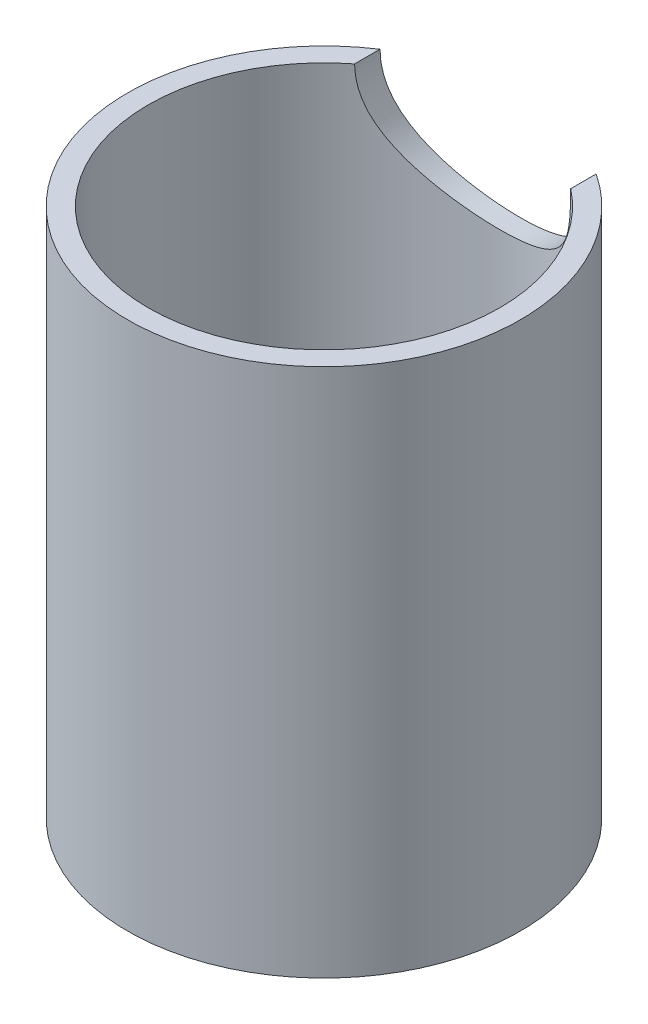
ISO-10303-21;
HEADER;
FILE_DESCRIPTION(('STEP AP214'),'2;1');
FILE_NAME('part.step','',(''),(''),'','','');
FILE_SCHEMA(('AUTOMOTIVE_DESIGN { 1 0 10303 214 1 1 1 1 }'));
ENDSEC;
DATA;
#1=APPLICATION_CONTEXT('core data for automotive mechanical design processes');
#2=APPLICATION_PROTOCOL_DEFINITION('international standard','automotive_design',2000,#1);
#3=PRODUCT_CONTEXT('',#1,'mechanical');
#4=PRODUCT('Part','Part','',(#3));
#5=PRODUCT_RELATED_PRODUCT_CATEGORY('part','',(#4));
#6=PRODUCT_DEFINITION_FORMATION('','',#4);
#7=PRODUCT_DEFINITION_CONTEXT('part definition',#1,'design');
#8=PRODUCT_DEFINITION('design','',#6,#7);
#9=PRODUCT_DEFINITION_SHAPE('','',#8);
#10=(LENGTH_UNIT() NAMED_UNIT(*) SI_UNIT(.MILLI.,.METRE.));
#11=(NAMED_UNIT(*) PLANE_ANGLE_UNIT() SI_UNIT($,.RADIAN.));
#12=(NAMED_UNIT(*) SI_UNIT($,.STERADIAN.) SOLID_ANGLE_UNIT());
#13=UNCERTAINTY_MEASURE_WITH_UNIT(LENGTH_MEASURE(1.E-05),#10,'distance_accuracy_value','');
#14=(GEOMETRIC_REPRESENTATION_CONTEXT(3) GLOBAL_UNCERTAINTY_ASSIGNED_CONTEXT((#13)) GLOBAL_UNIT_ASSIGNED_CONTEXT((#10,
#11,#12)) REPRESENTATION_CONTEXT('',''));
#15=CARTESIAN_POINT('',(0.,0.,0.));
#16=DIRECTION('',(0.,0.,1.));
#17=DIRECTION('',(1.,0.,0.));
#18=AXIS2_PLACEMENT_3D('',#15,#16,#17);
#19=CARTESIAN_POINT('',(0.,51.2,0.));
#20=DIRECTION('',(0.,1.,0.));
#21=DIRECTION('',(0.,0.,1.));
#22=AXIS2_PLACEMENT_3D('',#19,#20,#21);
#23=PLANE('',#22);
#24=DIRECTION('',(0.,0.,1.));
#25=VECTOR('',#24,1.);
#26=CARTESIAN_POINT('',(-10.45,51.2,-19.));
#27=LINE('',#26,#25);
#28=CARTESIAN_POINT('',(-10.45,51.2,-15.8681284340656));
#29=VERTEX_POINT('',#28);
#30=CARTESIAN_POINT('',(-10.45,51.2,-13.4088590118623));
#31=VERTEX_POINT('',#30);
#32=EDGE_CURVE('E62',#29,#31,#27,.T.);
#33=ORIENTED_EDGE('',*,*,#32,.F.);
#34=CARTESIAN_POINT('',(0.,51.2,0.));
#35=DIRECTION('',(0.,1.,0.));
#36=DIRECTION('',(0.,0.,1.));
#37=AXIS2_PLACEMENT_3D('',#34,#35,#36);
#38=CIRCLE('',#37,19.);
#39=CARTESIAN_POINT('',(10.45,51.2,-15.8681284340656));
#40=VERTEX_POINT('',#39);
#41=EDGE_CURVE('E85',#29,#40,#38,.T.);
#42=ORIENTED_EDGE('',*,*,#41,.T.);
#43=DIRECTION('',(0.,0.,1.));
#44=VECTOR('',#43,1.);
#45=CARTESIAN_POINT('',(10.45,51.2,-19.));
#46=LINE('',#45,#44);
#47=CARTESIAN_POINT('',(10.45,51.2,-13.4088590118623));
#48=VERTEX_POINT('',#47);
#49=EDGE_CURVE('E121',#48,#40,#46,.F.);
#50=ORIENTED_EDGE('',*,*,#49,.F.);
#51=CARTESIAN_POINT('',(0.,51.2,0.));
#52=DIRECTION('',(0.,1.,0.));
#53=DIRECTION('',(0.,0.,1.));
#54=AXIS2_PLACEMENT_3D('',#51,#52,#53);
#55=CIRCLE('',#54,17.);
#56=EDGE_CURVE('E94',#31,#48,#55,.T.);
#57=ORIENTED_EDGE('',*,*,#56,.F.);
#58=EDGE_LOOP('',(#33,#42,#50,#57));
#59=FACE_BOUND('',#58,.T.);
#60=ADVANCED_FACE('F33',(#59),#23,.T.);
#61=CARTESIAN_POINT('',(0.,0.,0.));
#62=DIRECTION('',(0.,1.,0.));
#63=DIRECTION('',(0.,0.,1.));
#64=AXIS2_PLACEMENT_3D('',#61,#62,#63);
#65=PLANE('',#64);
#66=CARTESIAN_POINT('',(0.,0.,0.));
#67=DIRECTION('',(0.,1.,0.));
#68=DIRECTION('',(0.,0.,1.));
#69=AXIS2_PLACEMENT_3D('',#66,#67,#68);
#70=CIRCLE('',#69,19.);
#71=CARTESIAN_POINT('',(-10.45,0.,-15.8681284340656));
#72=VERTEX_POINT('',#71);
#73=CARTESIAN_POINT('',(10.45,0.,-15.8681284340656));
#74=VERTEX_POINT('',#73);
#75=EDGE_CURVE('E90',#72,#74,#70,.T.);
#76=ORIENTED_EDGE('',*,*,#75,.F.);
#77=DIRECTION('',(0.,0.,1.));
#78=VECTOR('',#77,1.);
#79=CARTESIAN_POINT('',(-10.45,0.,-19.));
#80=LINE('',#79,#78);
#81=CARTESIAN_POINT('',(-10.45,0.,-13.4088590118623));
#82=VERTEX_POINT('',#81);
#83=EDGE_CURVE('E80',#72,#82,#80,.T.);
#84=ORIENTED_EDGE('',*,*,#83,.T.);
#85=CARTESIAN_POINT('',(0.,0.,0.));
#86=DIRECTION('',(0.,1.,0.));
#87=DIRECTION('',(0.,0.,1.));
#88=AXIS2_PLACEMENT_3D('',#85,#86,#87);
#89=CIRCLE('',#88,17.);
#90=CARTESIAN_POINT('',(10.45,0.,-13.4088590118623));
#91=VERTEX_POINT('',#90);
#92=EDGE_CURVE('E88',#82,#91,#89,.T.);
#93=ORIENTED_EDGE('',*,*,#92,.T.);
#94=DIRECTION('',(0.,0.,1.));
#95=VECTOR('',#94,1.);
#96=CARTESIAN_POINT('',(10.45,0.,-19.));
#97=LINE('',#96,#95);
#98=EDGE_CURVE('E55',#91,#74,#97,.F.);
#99=ORIENTED_EDGE('',*,*,#98,.T.);
#100=EDGE_LOOP('',(#76,#84,#93,#99));
#101=FACE_BOUND('',#100,.T.);
#102=ADVANCED_FACE('F87',(#101),#65,.F.);
#103=CARTESIAN_POINT('',(0.,51.2,0.));
#104=DIRECTION('',(0.,-1.,0.));
#105=DIRECTION('',(0.,0.,-1.));
#106=AXIS2_PLACEMENT_3D('',#103,#104,#105);
#107=CYLINDRICAL_SURFACE('',#106,19.);
#108=ORIENTED_EDGE('',*,*,#41,.F.);
#109=CARTESIAN_POINT('',(-10.45,51.2,-15.8681284340656));
#110=CARTESIAN_POINT('',(-10.4500012730181,51.0653833149891,-15.8681246559729));
#111=CARTESIAN_POINT('',(-10.4473981935161,50.9307864478376,-15.8698422115779));
#112=CARTESIAN_POINT('',(-10.4370032538798,50.6618869862102,-15.8766816326083));
#113=CARTESIAN_POINT('',(-10.4292116748264,50.5275843761886,-15.8818033136192));
#114=CARTESIAN_POINT('',(-10.3981046596639,50.1257493900968,-15.9022035166576));
#115=CARTESIAN_POINT('',(-10.3670568574151,49.8590162589393,-15.9225173529007));
#116=CARTESIAN_POINT('',(-10.2850919997626,49.3318171395036,-15.9755820898262));
#117=CARTESIAN_POINT('',(-10.2343115002847,49.0713208671769,-16.0082474732981));
#118=CARTESIAN_POINT('',(-10.1135634255716,48.5564693719258,-16.0848045161732));
#119=CARTESIAN_POINT('',(-10.0435929241274,48.3021150920111,-16.1286978876201));
#120=CARTESIAN_POINT('',(-9.88553018246522,47.8018502283056,-16.2260552771701));
#121=CARTESIAN_POINT('',(-9.79749089995467,47.5559173660677,-16.2794912687168));
#122=CARTESIAN_POINT('',(-9.60403995683278,47.0729436946843,-16.3943606685431));
#123=CARTESIAN_POINT('',(-9.49862864822692,46.8359027054843,-16.4557939147708));
#124=CARTESIAN_POINT('',(-9.27108162313204,46.3712752819912,-16.5850592272797));
#125=CARTESIAN_POINT('',(-9.14891684383235,46.1437061932698,-16.6529023479392));
#126=CARTESIAN_POINT('',(-8.8887926954681,45.6992566003047,-16.7931891214218));
#127=CARTESIAN_POINT('',(-8.75083177189294,45.482377151046,-16.8656332267182));
#128=CARTESIAN_POINT('',(-8.44524660649842,45.0388371524624,-17.0208707913538));
#129=CARTESIAN_POINT('',(-8.27603504615457,44.813377165401,-17.1039735239912));
#130=CARTESIAN_POINT('',(-7.92025692286623,44.3771517454434,-17.2716010378501));
#131=CARTESIAN_POINT('',(-7.73368933213889,44.1663871840702,-17.356125903044));
#132=CARTESIAN_POINT('',(-7.34394254747332,43.7603610419234,-17.5245996758007));
#133=CARTESIAN_POINT('',(-7.14075577283886,43.5651066169124,-17.6085483013791));
#134=CARTESIAN_POINT('',(-6.71875429802651,43.1912371415642,-17.7738481776533));
#135=CARTESIAN_POINT('',(-6.49994473541626,43.0126166652579,-17.8552002696029));
#136=CARTESIAN_POINT('',(-6.02796580951804,42.6583052928639,-18.0203050555937));
#137=CARTESIAN_POINT('',(-5.77346113451381,42.4842006174535,-18.1036579714908));
#138=CARTESIAN_POINT('',(-5.24829903158589,42.1582431644075,-18.262821138262));
#139=CARTESIAN_POINT('',(-4.97764042634378,42.0063920114297,-18.3386308383007));
#140=CARTESIAN_POINT('',(-4.42196345972371,41.7265930463403,-18.4804871163755));
#141=CARTESIAN_POINT('',(-4.13695324241697,41.5986318672827,-18.5465391496878));
#142=CARTESIAN_POINT('',(-3.55446192453808,41.3680942773136,-18.6669279387466));
#143=CARTESIAN_POINT('',(-3.25698249065588,41.2655144863877,-18.7212662542732));
#144=CARTESIAN_POINT('',(-2.67716156036428,41.0946097581584,-18.8125395654125));
#145=CARTESIAN_POINT('',(-2.39561869371007,41.0241454583119,-18.8505461022332));
#146=CARTESIAN_POINT('',(-1.82629028871861,40.9067196174583,-18.9141925377618));
#147=CARTESIAN_POINT('',(-1.53850506778543,40.8597568843797,-18.9398330637093));
#148=CARTESIAN_POINT('',(-0.959332065107864,40.7900428826343,-18.9779834579204));
#149=CARTESIAN_POINT('',(-0.667946639160714,40.7672765502572,-18.9905014956532));
#150=CARTESIAN_POINT('',(-0.0840349414601788,40.7462559718408,-19.0020572982258));
#151=CARTESIAN_POINT('',(0.208491238125646,40.7479997849005,-19.0010961304523));
#152=CARTESIAN_POINT('',(0.76138192815085,40.7744937192387,-18.986537018077));
#153=CARTESIAN_POINT('',(1.02190258118581,40.796812366127,-18.97427465686));
#154=CARTESIAN_POINT('',(1.53982717952239,40.8607784045931,-18.9392788647418));
#155=CARTESIAN_POINT('',(1.79723139030733,40.9024241376779,-18.9165463323066));
#156=CARTESIAN_POINT('',(2.30717744119805,41.0045568521245,-18.8611432232997));
#157=CARTESIAN_POINT('',(2.5597191899388,41.0650441871515,-18.8284724601834));
#158=CARTESIAN_POINT('',(3.05834942150661,41.2042006089911,-18.7539343956568));
#159=CARTESIAN_POINT('',(3.30443765326291,41.2828704020179,-18.7120667370384));
#160=CARTESIAN_POINT('',(3.79129051288055,41.4585271755928,-18.6195639348381));
#161=CARTESIAN_POINT('',(4.03197210941065,41.5556978168595,-18.5688413468723));
#162=CARTESIAN_POINT('',(4.5041424402967,41.7669661949012,-18.4599953673567));
#163=CARTESIAN_POINT('',(4.73562783881112,41.881070004232,-18.4018693218507));
#164=CARTESIAN_POINT('',(5.18824121521788,42.1252674186986,-18.279417775016));
#165=CARTESIAN_POINT('',(5.40937044515481,42.2553590839996,-18.215093025991));
#166=CARTESIAN_POINT('',(5.84049432233791,42.5307105559795,-18.0814707607809));
#167=CARTESIAN_POINT('',(6.05048492934415,42.6759758105097,-18.0121714613699));
#168=CARTESIAN_POINT('',(6.48046570029448,42.9972185556614,-17.8622736907849));
#169=CARTESIAN_POINT('',(6.69910080414364,43.1748188398789,-17.781261737982));
#170=CARTESIAN_POINT('',(7.12080538383842,43.546527105727,-17.6166222801085));
#171=CARTESIAN_POINT('',(7.32387371151187,43.7406363027964,-17.5329945827455));
#172=CARTESIAN_POINT('',(7.71384060763867,44.1446419237716,-17.3649587686544));
#173=CARTESIAN_POINT('',(7.90071979251648,44.3545567252083,-17.2805498467567));
#174=CARTESIAN_POINT('',(8.2572086769888,44.7890731994456,-17.1130738002932));
#175=CARTESIAN_POINT('',(8.42681820307708,45.0136750197678,-17.0300066892155));
#176=CARTESIAN_POINT('',(8.76216156562718,45.4972712232828,-16.8600984974949));
#177=CARTESIAN_POINT('',(8.92621372321557,45.7575485702563,-16.773577332291));
#178=CARTESIAN_POINT('',(9.23157338358675,46.293308113382,-16.6074766862903));
#179=CARTESIAN_POINT('',(9.37287755167582,46.5687925308484,-16.5278982240262));
#180=CARTESIAN_POINT('',(9.63098465736376,47.1327465828359,-16.3788369713242));
#181=CARTESIAN_POINT('',(9.74785006769434,47.4211807604486,-16.3093285822235));
#182=CARTESIAN_POINT('',(9.95602284359849,48.0097882905724,-16.1830919535635));
#183=CARTESIAN_POINT('',(10.0473407557039,48.3099567404351,-16.1263584421653));
#184=CARTESIAN_POINT('',(10.1785121378221,48.8236751008197,-16.0437477570263));
#185=CARTESIAN_POINT('',(10.2255185262193,49.0347704625161,-16.0137780908027));
#186=CARTESIAN_POINT('',(10.3064606327971,49.4603823158968,-15.9618037153635));
#187=CARTESIAN_POINT('',(10.3404001006948,49.6748978077028,-15.9397967212684));
#188=CARTESIAN_POINT('',(10.3949890356453,50.1071568553254,-15.9042551230562));
#189=CARTESIAN_POINT('',(10.4155869370567,50.3249096474307,-15.8907533975621));
#190=CARTESIAN_POINT('',(10.443108726044,50.7617680737177,-15.8726660496449));
#191=CARTESIAN_POINT('',(10.4500248155989,50.9808744080409,-15.8680855119231));
#192=CARTESIAN_POINT('',(10.45,51.2,-15.8681284340656));
#193=B_SPLINE_CURVE_WITH_KNOTS('',3,(#109,#110,#111,#112,#113,#114,#115,#116,#117,#118,#119,
#120,#121,#122,#123,#124,#125,#126,#127,#128,#129,#130,#131,#132,#133,#134,#135,#136,#137,#138,
#139,#140,#141,#142,#143,#144,#145,#146,#147,#148,#149,#150,#151,#152,#153,#154,#155,#156,#157,
#158,#159,#160,#161,#162,#163,#164,#165,#166,#167,#168,#169,#170,#171,#172,#173,#174,#175,#176,
#177,#178,#179,#180,#181,#182,#183,#184,#185,#186,#187,#188,#189,#190,#191,#192),.UNSPECIFIED.,
.F.,.F.,(4,2,2,2,2,2,2,2,2,2,2,2,2,2,2,2,2,2,2,2,2,2,2,2,2,2,2,2,2,2,2,2,2,2,2,2,2,2,2,2,2,4),
(0.,0.403774900877862,0.807527929500474,1.61421634347208,2.41541890435949,3.21674370550549,
4.01575261388323,4.81474533411242,5.61514205241606,6.41561760618315,7.29637563173928,
8.17718584693272,9.05840010095439,9.93932588987509,10.896356113444,11.853456171935,
12.8100190971677,13.7664545692164,14.6433457334633,15.5201924145922,16.3964928857487,
17.2727239651172,18.0570787544756,18.8413662493439,19.6256684665201,20.4100011514402,
21.202569498715,21.9954227660016,22.7881799298052,23.5812227060215,24.4595921876933,
25.338026393811,26.2174982342825,27.0969789098323,28.0545593291095,29.0122799953023,
29.9675216788514,30.92236843516,31.5768566276699,32.2311568663348,32.8879711427837,
33.5451596662769),.UNSPECIFIED.);
#194=EDGE_CURVE('E95',#29,#40,#193,.T.);
#195=ORIENTED_EDGE('',*,*,#194,.T.);
#196=EDGE_LOOP('',(#108,#195));
#197=FACE_BOUND('',#196,.T.);
#198=ORIENTED_EDGE('',*,*,#75,.T.);
#199=CARTESIAN_POINT('',(10.45,0.,-15.8681284340656));
#200=CARTESIAN_POINT('',(10.4500012730181,0.13461668501087,-15.8681246559729));
#201=CARTESIAN_POINT('',(10.4473981935161,0.269213552162404,-15.8698422115779));
#202=CARTESIAN_POINT('',(10.4370032538798,0.53811301378984,-15.8766816326083));
#203=CARTESIAN_POINT('',(10.4292116748264,0.672415623811373,-15.8818033136192));
#204=CARTESIAN_POINT('',(10.3981046596639,1.07425060990325,-15.9022035166576));
#205=CARTESIAN_POINT('',(10.3670568574151,1.3409837410607,-15.9225173529007));
#206=CARTESIAN_POINT('',(10.2850919997626,1.86818286049645,-15.9755820898262));
#207=CARTESIAN_POINT('',(10.2343115002847,2.12867913282309,-16.0082474732981));
#208=CARTESIAN_POINT('',(10.1135634255716,2.6435306280742,-16.0848045161732));
#209=CARTESIAN_POINT('',(10.0435929241274,2.89788490798893,-16.1286978876201));
#210=CARTESIAN_POINT('',(9.88553018246523,3.39814977169438,-16.2260552771701));
#211=CARTESIAN_POINT('',(9.79749089995467,3.64408263393226,-16.2794912687168));
#212=CARTESIAN_POINT('',(9.60403995683279,4.12705630531565,-16.3943606685431));
#213=CARTESIAN_POINT('',(9.49862864822693,4.36409729451573,-16.4557939147708));
#214=CARTESIAN_POINT('',(9.27108162313205,4.82872471800875,-16.5850592272797));
#215=CARTESIAN_POINT('',(9.14891684383235,5.0562938067302,-16.6529023479392));
#216=CARTESIAN_POINT('',(8.88879269546811,5.50074339969534,-16.7931891214218));
#217=CARTESIAN_POINT('',(8.75083177189294,5.71762284895399,-16.8656332267182));
#218=CARTESIAN_POINT('',(8.44524660649842,6.16116284753757,-17.0208707913538));
#219=CARTESIAN_POINT('',(8.27603504615457,6.38662283459905,-17.1039735239912));
#220=CARTESIAN_POINT('',(7.92025692286624,6.82284825455656,-17.2716010378501));
#221=CARTESIAN_POINT('',(7.7336893321389,7.03361281592981,-17.356125903044));
#222=CARTESIAN_POINT('',(7.34394254747332,7.43963895807659,-17.5245996758007));
#223=CARTESIAN_POINT('',(7.14075577283886,7.63489338308757,-17.6085483013791));
#224=CARTESIAN_POINT('',(6.71875429802652,8.00876285843584,-17.7738481776533));
#225=CARTESIAN_POINT('',(6.49994473541627,8.18738333474212,-17.8552002696029));
#226=CARTESIAN_POINT('',(6.02796580951805,8.54169470713606,-18.0203050555937));
#227=CARTESIAN_POINT('',(5.77346113451382,8.71579938254646,-18.1036579714908));
#228=CARTESIAN_POINT('',(5.2482990315859,9.04175683559255,-18.262821138262));
#229=CARTESIAN_POINT('',(4.97764042634379,9.19360798857028,-18.3386308383007));
#230=CARTESIAN_POINT('',(4.42196345972372,9.47340695365971,-18.4804871163755));
#231=CARTESIAN_POINT('',(4.13695324241697,9.60136813271735,-18.5465391496878));
#232=CARTESIAN_POINT('',(3.55446192453809,9.83190572268642,-18.6669279387466));
#233=CARTESIAN_POINT('',(3.25698249065589,9.93448551361228,-18.7212662542732));
#234=CARTESIAN_POINT('',(2.6771615603643,10.1053902418416,-18.8125395654125));
#235=CARTESIAN_POINT('',(2.39561869371008,10.1758545416881,-18.8505461022332));
#236=CARTESIAN_POINT('',(1.82629028871862,10.2932803825418,-18.9141925377618));
#237=CARTESIAN_POINT('',(1.53850506778544,10.3402431156203,-18.9398330637093));
#238=CARTESIAN_POINT('',(0.959332065107876,10.4099571173657,-18.9779834579204));
#239=CARTESIAN_POINT('',(0.667946639160726,10.4327234497428,-18.9905014956532));
#240=CARTESIAN_POINT('',(0.0840349414601904,10.4537440281592,-19.0020572982258));
#241=CARTESIAN_POINT('',(-0.208491238125635,10.4520002150995,-19.0010961304523));
#242=CARTESIAN_POINT('',(-0.76138192815084,10.4255062807613,-18.986537018077));
#243=CARTESIAN_POINT('',(-1.0219025811858,10.403187633873,-18.97427465686));
#244=CARTESIAN_POINT('',(-1.53982717952238,10.3392215954069,-18.9392788647418));
#245=CARTESIAN_POINT('',(-1.79723139030732,10.2975758623221,-18.9165463323066));
#246=CARTESIAN_POINT('',(-2.30717744119804,10.1954431478755,-18.8611432232997));
#247=CARTESIAN_POINT('',(-2.55971918993879,10.1349558128485,-18.8284724601834));
#248=CARTESIAN_POINT('',(-3.0583494215066,9.9957993910089,-18.7539343956568));
#249=CARTESIAN_POINT('',(-3.3044376532629,9.91712959798211,-18.7120667370384));
#250=CARTESIAN_POINT('',(-3.79129051288054,9.74147282440722,-18.6195639348381));
#251=CARTESIAN_POINT('',(-4.03197210941064,9.64430218314055,-18.5688413468723));
#252=CARTESIAN_POINT('',(-4.50414244029669,9.4330338050988,-18.4599953673567));
#253=CARTESIAN_POINT('',(-4.73562783881111,9.31892999576798,-18.4018693218507));
#254=CARTESIAN_POINT('',(-5.18824121521788,9.07473258130145,-18.279417775016));
#255=CARTESIAN_POINT('',(-5.4093704451548,8.94464091600042,-18.215093025991));
#256=CARTESIAN_POINT('',(-5.8404943223379,8.66928944402046,-18.0814707607809));
#257=CARTESIAN_POINT('',(-6.05048492934414,8.52402418949034,-18.0121714613699));
#258=CARTESIAN_POINT('',(-6.48046570029447,8.2027814443386,-17.8622736907849));
#259=CARTESIAN_POINT('',(-6.69910080414364,8.02518116012107,-17.781261737982));
#260=CARTESIAN_POINT('',(-7.12080538383842,7.65347289427305,-17.6166222801085));
#261=CARTESIAN_POINT('',(-7.32387371151186,7.45936369720357,-17.5329945827455));
#262=CARTESIAN_POINT('',(-7.71384060763866,7.0553580762284,-17.3649587686544));
#263=CARTESIAN_POINT('',(-7.90071979251648,6.8454432747917,-17.2805498467567));
#264=CARTESIAN_POINT('',(-8.2572086769888,6.41092680055438,-17.1130738002932));
#265=CARTESIAN_POINT('',(-8.42681820307707,6.18632498023225,-17.0300066892155));
#266=CARTESIAN_POINT('',(-8.76216156562717,5.70272877671721,-16.8600984974949));
#267=CARTESIAN_POINT('',(-8.92621372321556,5.44245142974373,-16.773577332291));
#268=CARTESIAN_POINT('',(-9.23157338358674,4.906691886618,-16.6074766862903));
#269=CARTESIAN_POINT('',(-9.37287755167582,4.63120746915158,-16.5278982240262));
#270=CARTESIAN_POINT('',(-9.63098465736375,4.06725341716415,-16.3788369713242));
#271=CARTESIAN_POINT('',(-9.74785006769433,3.77881923955143,-16.3093285822235));
#272=CARTESIAN_POINT('',(-9.95602284359848,3.19021170942761,-16.1830919535635));
#273=CARTESIAN_POINT('',(-10.0473407557039,2.89004325956497,-16.1263584421653));
#274=CARTESIAN_POINT('',(-10.1785121378221,2.37632489918034,-16.0437477570263));
#275=CARTESIAN_POINT('',(-10.2255185262193,2.16522953748394,-16.0137780908027));
#276=CARTESIAN_POINT('',(-10.3064606327971,1.73961768410317,-15.9618037153635));
#277=CARTESIAN_POINT('',(-10.3404001006948,1.52510219229721,-15.9397967212684));
#278=CARTESIAN_POINT('',(-10.3949890356453,1.09284314467457,-15.9042551230562));
#279=CARTESIAN_POINT('',(-10.4155869370567,0.875090352569286,-15.8907533975621));
#280=CARTESIAN_POINT('',(-10.443108726044,0.438231926282308,-15.8726660496449));
#281=CARTESIAN_POINT('',(-10.4500248155989,0.219125591959081,-15.8680855119231));
#282=CARTESIAN_POINT('',(-10.45,0.,-15.8681284340656));
#283=B_SPLINE_CURVE_WITH_KNOTS('',3,(#199,#200,#201,#202,#203,#204,#205,#206,#207,#208,#209,
#210,#211,#212,#213,#214,#215,#216,#217,#218,#219,#220,#221,#222,#223,#224,#225,#226,#227,#228,
#229,#230,#231,#232,#233,#234,#235,#236,#237,#238,#239,#240,#241,#242,#243,#244,#245,#246,#247,
#248,#249,#250,#251,#252,#253,#254,#255,#256,#257,#258,#259,#260,#261,#262,#263,#264,#265,#266,
#267,#268,#269,#270,#271,#272,#273,#274,#275,#276,#277,#278,#279,#280,#281,#282),.UNSPECIFIED.,
.F.,.F.,(4,2,2,2,2,2,2,2,2,2,2,2,2,2,2,2,2,2,2,2,2,2,2,2,2,2,2,2,2,2,2,2,2,2,2,2,2,2,2,2,2,4),
(0.,0.403774900877858,0.807527929500476,1.61421634347208,2.41541890435949,3.21674370550549,
4.01575261388323,4.81474533411241,5.61514205241605,6.41561760618316,7.29637563173928,
8.17718584693272,9.05840010095439,9.93932588987509,10.896356113444,11.853456171935,
12.8100190971677,13.7664545692164,14.6433457334633,15.5201924145922,16.3964928857487,
17.2727239651172,18.0570787544756,18.8413662493439,19.6256684665201,20.4100011514402,
21.202569498715,21.9954227660016,22.7881799298052,23.5812227060215,24.4595921876933,
25.338026393811,26.2174982342825,27.0969789098323,28.0545593291094,29.0122799953022,
29.9675216788514,30.92236843516,31.5768566276699,32.2311568663348,32.8879711427837,
33.5451596662769),.UNSPECIFIED.);
#284=EDGE_CURVE('E91',#74,#72,#283,.T.);
#285=ORIENTED_EDGE('',*,*,#284,.T.);
#286=EDGE_LOOP('',(#198,#285));
#287=FACE_BOUND('',#286,.T.);
#288=ADVANCED_FACE('F35',(#197,#287),#107,.T.);
#289=CARTESIAN_POINT('',(0.,51.2,0.));
#290=DIRECTION('',(0.,-1.,0.));
#291=DIRECTION('',(0.,0.,-1.));
#292=AXIS2_PLACEMENT_3D('',#289,#290,#291);
#293=CYLINDRICAL_SURFACE('',#292,17.);
#294=CARTESIAN_POINT('',(-10.45,51.2,-13.4088590118623));
#295=CARTESIAN_POINT('',(-10.4500016789845,51.0686337794725,-13.4088541572394));
#296=CARTESIAN_POINT('',(-10.4475222672895,50.9372882052657,-13.4107904105973));
#297=CARTESIAN_POINT('',(-10.4376246403045,50.6749055694247,-13.4184965470656));
#298=CARTESIAN_POINT('',(-10.4302067967983,50.5438684853114,-13.4242661415876));
#299=CARTESIAN_POINT('',(-10.400605590222,50.1519283260879,-13.4472327477521));
#300=CARTESIAN_POINT('',(-10.3710744194583,49.8918562018527,-13.4700878319086));
#301=CARTESIAN_POINT('',(-10.2932705861211,49.3784713776937,-13.5296315402958));
#302=CARTESIAN_POINT('',(-10.2451571605142,49.1251202835521,-13.5662025535828));
#303=CARTESIAN_POINT('',(-10.1309307273382,48.6246063490174,-13.6517151181135));
#304=CARTESIAN_POINT('',(-10.0648137995665,48.3774448692065,-13.7006593634209));
#305=CARTESIAN_POINT('',(-9.9157551274329,47.8917422628029,-13.8089183449436));
#306=CARTESIAN_POINT('',(-9.83288230639036,47.6531703929348,-13.8681904649574));
#307=CARTESIAN_POINT('',(-9.65106590346022,47.1847027797343,-13.9953298109086));
#308=CARTESIAN_POINT('',(-9.55212286921314,46.9548067410757,-14.0631967439348));
#309=CARTESIAN_POINT('',(-9.23185957800874,46.278166891187,-14.2772046451817));
#310=CARTESIAN_POINT('',(-8.98735726104967,45.8452815737382,-14.4335609359013));
#311=CARTESIAN_POINT('',(-8.56152102231486,45.2016215815086,-14.6878355359943));
#312=CARTESIAN_POINT('',(-8.39905671873858,44.9762261865592,-14.7815453362588));
#313=CARTESIAN_POINT('',(-8.05705211526095,44.5394235374984,-14.9707063775197));
#314=CARTESIAN_POINT('',(-7.87751062933236,44.3280172566763,-15.0661577390966));
#315=CARTESIAN_POINT('',(-7.50200073041893,43.9199288153027,-15.2566163813905));
#316=CARTESIAN_POINT('',(-7.30602411072883,43.7232541047137,-15.3516234149376));
#317=CARTESIAN_POINT('',(-6.89843574862987,43.3456232971896,-15.5390437858373));
#318=CARTESIAN_POINT('',(-6.686828909363,43.1646623093462,-15.6314579241249));
#319=CARTESIAN_POINT('',(-6.22318813172864,42.7993252754255,-15.8221938533834));
#320=CARTESIAN_POINT('',(-5.96931166941218,42.6169864808142,-15.9199580569215));
#321=CARTESIAN_POINT('',(-5.44401157593134,42.2745569197055,-16.1071562760401));
#322=CARTESIAN_POINT('',(-5.17258624093412,42.1144683182624,-16.1965894806942));
#323=CARTESIAN_POINT('',(-4.61387811632682,41.818395588823,-16.3645087120849));
#324=CARTESIAN_POINT('',(-4.32660603717113,41.682395435543,-16.4430020093315));
#325=CARTESIAN_POINT('',(-3.73801548887643,41.4362176937304,-16.5867100642199));
#326=CARTESIAN_POINT('',(-3.43669948300291,41.3260355970649,-16.6519271397829));
#327=CARTESIAN_POINT('',(-2.85296304022826,41.1428038855092,-16.7612603522348));
#328=CARTESIAN_POINT('',(-2.57162886042506,41.067156653719,-16.8068270356898));
#329=CARTESIAN_POINT('',(-2.00179907478318,40.9393699558824,-16.8841770592588));
#330=CARTESIAN_POINT('',(-1.71330390039303,40.8872290771925,-16.9159612276458));
#331=CARTESIAN_POINT('',(-1.13196010348984,40.8073495843409,-16.9647777371909));
#332=CARTESIAN_POINT('',(-0.839115321493686,40.7795906093133,-16.9818223868577));
#333=CARTESIAN_POINT('',(-0.251650308829427,40.7488921879124,-17.0006764963493));
#334=CARTESIAN_POINT('',(0.042969724049491,40.7459500259374,-17.0024876231158));
#335=CARTESIAN_POINT('',(0.592782921886378,40.7636868022256,-16.9915893232121));
#336=CARTESIAN_POINT('',(0.848117536596149,40.7813416709023,-16.9807388347227));
#337=CARTESIAN_POINT('',(1.35605911944278,40.835212867093,-16.9477389571389));
#338=CARTESIAN_POINT('',(1.60866638039186,40.8714271813951,-16.9255907935466));
#339=CARTESIAN_POINT('',(2.10941622031666,40.9619527320886,-16.870501610569));
#340=CARTESIAN_POINT('',(2.35755863344681,41.0162646392537,-16.8375601911404));
#341=CARTESIAN_POINT('',(2.84779298464471,41.1423343585281,-16.7616111458558));
#342=CARTESIAN_POINT('',(3.08988466956759,41.214092899211,-16.7186030996189));
#343=CARTESIAN_POINT('',(3.56750323884863,41.3745672383424,-16.6232502846652));
#344=CARTESIAN_POINT('',(3.80300258576442,41.4633446654061,-16.5708716307036));
#345=CARTESIAN_POINT('',(4.26540382756851,41.6568519652036,-16.4579160849065));
#346=CARTESIAN_POINT('',(4.49230263473468,41.7615875006499,-16.3973362837594));
#347=CARTESIAN_POINT('',(4.9363898310726,41.9860732790475,-16.2691566174627));
#348=CARTESIAN_POINT('',(5.15358069168549,42.1058196706719,-16.201558553746));
#349=CARTESIAN_POINT('',(5.57760030877383,42.3595279951062,-16.0605206469045));
#350=CARTESIAN_POINT('',(5.78442531644258,42.4934950169632,-15.9870787148415));
#351=CARTESIAN_POINT('',(6.21159968858566,42.7919999155316,-15.8263786899815));
#352=CARTESIAN_POINT('',(6.4305150799037,42.9582731499004,-15.7385287542204));
#353=CARTESIAN_POINT('',(6.85365645458798,43.3066474686888,-15.5589277981068));
#354=CARTESIAN_POINT('',(7.05788135598757,43.4887497167513,-15.4671764912054));
#355=CARTESIAN_POINT('',(7.45130945292395,43.8681993204549,-15.2815370133693));
#356=CARTESIAN_POINT('',(7.6404874454889,44.0655712051773,-15.1876455826355));
#357=CARTESIAN_POINT('',(8.0028202731944,44.4745253456817,-14.9998836905459));
#358=CARTESIAN_POINT('',(8.17597445606018,44.6861081793385,-14.9060132301989));
#359=CARTESIAN_POINT('',(8.52629228374867,45.1502353099754,-14.7087608914549));
#360=CARTESIAN_POINT('',(8.70123066437343,45.4045874092517,-14.605664251382));
#361=CARTESIAN_POINT('',(9.0288700039467,45.9295402667141,-14.4054289768934));
#362=CARTESIAN_POINT('',(9.18156733704143,46.2001436641402,-14.3082913154328));
#363=CARTESIAN_POINT('',(9.46288043415531,46.7555687262275,-14.1238132069251));
#364=CARTESIAN_POINT('',(9.5915758442556,47.0403392452474,-14.0364407570738));
#365=CARTESIAN_POINT('',(9.82392353738529,47.6234870355837,-13.8748183284782));
#366=CARTESIAN_POINT('',(9.92758421873631,47.9218597037887,-13.8005639513059));
#367=CARTESIAN_POINT('',(10.0881609343868,48.4627535593275,-13.6834415964154));
#368=CARTESIAN_POINT('',(10.150345126634,48.7030028219605,-13.6372647011029));
#369=CARTESIAN_POINT('',(10.2577238457191,49.1891461560396,-13.5566816989895));
#370=CARTESIAN_POINT('',(10.3029244168148,49.4350381861752,-13.5222714049955));
#371=CARTESIAN_POINT('',(10.3759666287514,49.932888530347,-13.4663088771022));
#372=CARTESIAN_POINT('',(10.4036692599731,50.1848793069361,-13.4448596672739));
#373=CARTESIAN_POINT('',(10.4314356690218,50.5645446718829,-13.4233106521757));
#374=CARTESIAN_POINT('',(10.4383932457931,50.6914639387983,-13.4178983904864));
#375=CARTESIAN_POINT('',(10.4476763220687,50.9455825850287,-13.4106703006094));
#376=CARTESIAN_POINT('',(10.4500014997864,51.0727819831885,-13.408854722263));
#377=CARTESIAN_POINT('',(10.45,51.2,-13.4088590118623));
#378=B_SPLINE_CURVE_WITH_KNOTS('',3,(#294,#295,#296,#297,#298,#299,#300,#301,#302,#303,#304,
#305,#306,#307,#308,#309,#310,#311,#312,#313,#314,#315,#316,#317,#318,#319,#320,#321,#322,#323,
#324,#325,#326,#327,#328,#329,#330,#331,#332,#333,#334,#335,#336,#337,#338,#339,#340,#341,#342,
#343,#344,#345,#346,#347,#348,#349,#350,#351,#352,#353,#354,#355,#356,#357,#358,#359,#360,#361,
#362,#363,#364,#365,#366,#367,#368,#369,#370,#371,#372,#373,#374,#375,#376,#377),.UNSPECIFIED.,
.F.,.F.,(4,2,2,2,2,2,2,2,2,2,2,2,2,2,2,2,2,2,2,2,2,2,2,2,2,2,2,2,2,2,2,2,2,2,2,2,2,2,2,2,2,4),
(0.,0.39402052027217,0.788011380548571,1.57497685216363,2.35534307528147,3.13587935661563,
3.91326803027608,4.69063021765164,6.24793899173511,7.12696615499735,8.00605441220541,
8.88558427651732,9.76483939782744,10.7460513373218,11.7273586868752,12.7080107313461,
13.6884914147566,14.5718150911893,15.4550856761081,16.3376179552878,17.2200536613366,
17.9876550034102,18.7551730985337,19.5227196443004,20.290298248409,21.0607107784408,
21.8313973277269,22.6018865455762,23.3726524290886,24.2375676876565,25.1025465828596,
25.9689450406774,26.835378751129,27.8105769014045,28.785933856149,29.7579943221836,
30.7297282397746,31.4861697211284,32.2423417388797,33.0044478925343,33.3860046963116,
33.7675880037605),.UNSPECIFIED.);
#379=EDGE_CURVE('E11',#31,#48,#378,.T.);
#380=ORIENTED_EDGE('',*,*,#379,.F.);
#381=ORIENTED_EDGE('',*,*,#56,.T.);
#382=EDGE_LOOP('',(#380,#381));
#383=FACE_BOUND('',#382,.T.);
#384=CARTESIAN_POINT('',(10.45,0.,-13.4088590118623));
#385=CARTESIAN_POINT('',(10.4500016789845,0.131366220527547,-13.4088541572394));
#386=CARTESIAN_POINT('',(10.4475222672895,0.262711794734319,-13.4107904105973));
#387=CARTESIAN_POINT('',(10.4376246403045,0.525094430575268,-13.4184965470656));
#388=CARTESIAN_POINT('',(10.4302067967983,0.656131514688558,-13.4242661415876));
#389=CARTESIAN_POINT('',(10.400605590222,1.0480716739121,-13.4472327477521));
#390=CARTESIAN_POINT('',(10.3710744194583,1.30814379814734,-13.4700878319086));
#391=CARTESIAN_POINT('',(10.2932705861211,1.82152862230625,-13.5296315402958));
#392=CARTESIAN_POINT('',(10.2451571605142,2.07487971644789,-13.5662025535829));
#393=CARTESIAN_POINT('',(10.1309307273382,2.5753936509826,-13.6517151181135));
#394=CARTESIAN_POINT('',(10.0648137995665,2.82255513079347,-13.7006593634209));
#395=CARTESIAN_POINT('',(9.9157551274329,3.30825773719713,-13.8089183449436));
#396=CARTESIAN_POINT('',(9.83288230639037,3.54682960706515,-13.8681904649574));
#397=CARTESIAN_POINT('',(9.65106590346022,4.01529722026574,-13.9953298109086));
#398=CARTESIAN_POINT('',(9.55212286921314,4.24519325892428,-14.0631967439348));
#399=CARTESIAN_POINT('',(9.23185957800874,4.92183310881298,-14.2772046451817));
#400=CARTESIAN_POINT('',(8.98735726104967,5.35471842626176,-14.4335609359013));
#401=CARTESIAN_POINT('',(8.56152102231486,5.99837841849143,-14.6878355359943));
#402=CARTESIAN_POINT('',(8.39905671873859,6.22377381344076,-14.7815453362588));
#403=CARTESIAN_POINT('',(8.05705211526095,6.66057646250158,-14.9707063775197));
#404=CARTESIAN_POINT('',(7.87751062933237,6.87198274332373,-15.0661577390966));
#405=CARTESIAN_POINT('',(7.50200073041894,7.28007118469729,-15.2566163813905));
#406=CARTESIAN_POINT('',(7.30602411072884,7.47674589528631,-15.3516234149375));
#407=CARTESIAN_POINT('',(6.89843574862988,7.85437670281038,-15.5390437858373));
#408=CARTESIAN_POINT('',(6.68682890936302,8.03533769065375,-15.6314579241248));
#409=CARTESIAN_POINT('',(6.22318813172866,8.40067472457449,-15.8221938533834));
#410=CARTESIAN_POINT('',(5.9693116694122,8.58301351918576,-15.9199580569214));
#411=CARTESIAN_POINT('',(5.44401157593135,8.92544308029453,-16.1071562760401));
#412=CARTESIAN_POINT('',(5.17258624093414,9.08553168173755,-16.1965894806942));
#413=CARTESIAN_POINT('',(4.61387811632684,9.38160441117704,-16.3645087120849));
#414=CARTESIAN_POINT('',(4.32660603717115,9.51760456445695,-16.4430020093315));
#415=CARTESIAN_POINT('',(3.73801548887644,9.76378230626955,-16.5867100642199));
#416=CARTESIAN_POINT('',(3.43669948300293,9.87396440293508,-16.6519271397829));
#417=CARTESIAN_POINT('',(2.85296304022828,10.0571961144908,-16.7612603522348));
#418=CARTESIAN_POINT('',(2.57162886042507,10.132843346281,-16.8068270356898));
#419=CARTESIAN_POINT('',(2.00179907478319,10.2606300441176,-16.8841770592588));
#420=CARTESIAN_POINT('',(1.71330390039305,10.3127709228075,-16.9159612276458));
#421=CARTESIAN_POINT('',(1.13196010348985,10.3926504156591,-16.9647777371909));
#422=CARTESIAN_POINT('',(0.8391153214937,10.4204093906867,-16.9818223868577));
#423=CARTESIAN_POINT('',(0.251650308829441,10.4511078120876,-17.0006764963493));
#424=CARTESIAN_POINT('',(-0.0429697240494779,10.4540499740626,-17.0024876231158));
#425=CARTESIAN_POINT('',(-0.592782921886365,10.4363131977744,-16.9915893232121));
#426=CARTESIAN_POINT('',(-0.848117536596136,10.4186583290978,-16.9807388347227));
#427=CARTESIAN_POINT('',(-1.35605911944277,10.364787132907,-16.9477389571389));
#428=CARTESIAN_POINT('',(-1.60866638039185,10.328572818605,-16.9255907935466));
#429=CARTESIAN_POINT('',(-2.10941622031665,10.2380472679114,-16.870501610569));
#430=CARTESIAN_POINT('',(-2.3575586334468,10.1837353607463,-16.8375601911404));
#431=CARTESIAN_POINT('',(-2.84779298464469,10.0576656414719,-16.7616111458558));
#432=CARTESIAN_POINT('',(-3.08988466956758,9.98590710078902,-16.7186030996189));
#433=CARTESIAN_POINT('',(-3.56750323884862,9.82543276165759,-16.6232502846652));
#434=CARTESIAN_POINT('',(-3.8030025857644,9.73665533459388,-16.5708716307036));
#435=CARTESIAN_POINT('',(-4.26540382756849,9.54314803479644,-16.4579160849065));
#436=CARTESIAN_POINT('',(-4.49230263473467,9.43841249935007,-16.3973362837594));
#437=CARTESIAN_POINT('',(-4.93638983107259,9.21392672095255,-16.2691566174627));
#438=CARTESIAN_POINT('',(-5.15358069168548,9.09418032932807,-16.201558553746));
#439=CARTESIAN_POINT('',(-5.57760030877382,8.84047200489378,-16.0605206469045));
#440=CARTESIAN_POINT('',(-5.78442531644257,8.70650498303678,-15.9870787148415));
#441=CARTESIAN_POINT('',(-6.21159968858565,8.40800008446845,-15.8263786899815));
#442=CARTESIAN_POINT('',(-6.43051507990369,8.24172685009958,-15.7385287542204));
#443=CARTESIAN_POINT('',(-6.85365645458797,7.89335253131125,-15.5589277981068));
#444=CARTESIAN_POINT('',(-7.05788135598756,7.71125028324875,-15.4671764912054));
#445=CARTESIAN_POINT('',(-7.45130945292394,7.33180067954512,-15.2815370133693));
#446=CARTESIAN_POINT('',(-7.6404874454889,7.13442879482267,-15.1876455826355));
#447=CARTESIAN_POINT('',(-8.0028202731944,6.7254746543183,-14.9998836905459));
#448=CARTESIAN_POINT('',(-8.17597445606017,6.5138918206615,-14.9060132301989));
#449=CARTESIAN_POINT('',(-8.52629228374866,6.04976469002462,-14.7087608914549));
#450=CARTESIAN_POINT('',(-8.70123066437343,5.7954125907483,-14.605664251382));
#451=CARTESIAN_POINT('',(-9.02887000394669,5.27045973328591,-14.4054289768934));
#452=CARTESIAN_POINT('',(-9.18156733704143,4.99985633585977,-14.3082913154328));
#453=CARTESIAN_POINT('',(-9.4628804341553,4.44443127377249,-14.1238132069251));
#454=CARTESIAN_POINT('',(-9.59157584425559,4.15966075475266,-14.0364407570738));
#455=CARTESIAN_POINT('',(-9.82392353738528,3.57651296441628,-13.8748183284782));
#456=CARTESIAN_POINT('',(-9.92758421873631,3.27814029621129,-13.8005639513059));
#457=CARTESIAN_POINT('',(-10.0881609343868,2.73724644067248,-13.6834415964154));
#458=CARTESIAN_POINT('',(-10.150345126634,2.4969971780395,-13.6372647011029));
#459=CARTESIAN_POINT('',(-10.2577238457191,2.01085384396039,-13.5566816989895));
#460=CARTESIAN_POINT('',(-10.3029244168148,1.76496181382482,-13.5222714049955));
#461=CARTESIAN_POINT('',(-10.3759666287514,1.26711146965298,-13.4663088771022));
#462=CARTESIAN_POINT('',(-10.4036692599731,1.01512069306391,-13.4448596672739));
#463=CARTESIAN_POINT('',(-10.4314356690218,0.635455328117067,-13.4233106521757));
#464=CARTESIAN_POINT('',(-10.4383932457931,0.508536061201726,-13.4178983904864));
#465=CARTESIAN_POINT('',(-10.4476763220687,0.254417414971308,-13.4106703006094));
#466=CARTESIAN_POINT('',(-10.4500014997864,0.127218016811463,-13.408854722263));
#467=CARTESIAN_POINT('',(-10.45,0.,-13.4088590118623));
#468=B_SPLINE_CURVE_WITH_KNOTS('',3,(#384,#385,#386,#387,#388,#389,#390,#391,#392,#393,#394,
#395,#396,#397,#398,#399,#400,#401,#402,#403,#404,#405,#406,#407,#408,#409,#410,#411,#412,#413,
#414,#415,#416,#417,#418,#419,#420,#421,#422,#423,#424,#425,#426,#427,#428,#429,#430,#431,#432,
#433,#434,#435,#436,#437,#438,#439,#440,#441,#442,#443,#444,#445,#446,#447,#448,#449,#450,#451,
#452,#453,#454,#455,#456,#457,#458,#459,#460,#461,#462,#463,#464,#465,#466,#467),.UNSPECIFIED.,
.F.,.F.,(4,2,2,2,2,2,2,2,2,2,2,2,2,2,2,2,2,2,2,2,2,2,2,2,2,2,2,2,2,2,2,2,2,2,2,2,2,2,2,2,2,4),
(0.,0.394020520272171,0.788011380548565,1.57497685216363,2.35534307528147,3.13587935661562,
3.91326803027607,4.69063021765164,6.24793899173511,7.12696615499734,8.0060544122054,
8.88558427651731,9.76483939782743,10.7460513373218,11.7273586868751,12.7080107313461,
13.6884914147566,14.5718150911893,15.4550856761081,16.3376179552878,17.2200536613366,
17.9876550034102,18.7551730985337,19.5227196443004,20.2902982484089,21.0607107784408,
21.8313973277269,22.6018865455762,23.3726524290886,24.2375676876565,25.1025465828596,
25.9689450406774,26.835378751129,27.8105769014045,28.785933856149,29.7579943221836,
30.7297282397746,31.4861697211284,32.2423417388797,33.0044478925343,33.3860046963116,
33.7675880037605),.UNSPECIFIED.);
#469=EDGE_CURVE('E48',#91,#82,#468,.T.);
#470=ORIENTED_EDGE('',*,*,#469,.F.);
#471=ORIENTED_EDGE('',*,*,#92,.F.);
#472=EDGE_LOOP('',(#470,#471));
#473=FACE_BOUND('',#472,.T.);
#474=ADVANCED_FACE('F93',(#383,#473),#293,.F.);
#475=CARTESIAN_POINT('',(0.,0.,-19.));
#476=DIRECTION('',(0.,0.,1.));
#477=DIRECTION('',(1.,0.,0.));
#478=AXIS2_PLACEMENT_3D('',#475,#476,#477);
#479=CYLINDRICAL_SURFACE('',#478,10.45);
#480=ORIENTED_EDGE('',*,*,#98,.F.);
#481=ORIENTED_EDGE('',*,*,#469,.T.);
#482=ORIENTED_EDGE('',*,*,#83,.F.);
#483=ORIENTED_EDGE('',*,*,#284,.F.);
#484=EDGE_LOOP('',(#480,#481,#482,#483));
#485=FACE_BOUND('',#484,.T.);
#486=ADVANCED_FACE('F79',(#485),#479,.F.);
#487=CARTESIAN_POINT('',(0.,51.2,-19.));
#488=DIRECTION('',(0.,0.,1.));
#489=DIRECTION('',(1.,0.,0.));
#490=AXIS2_PLACEMENT_3D('',#487,#488,#489);
#491=CYLINDRICAL_SURFACE('',#490,10.45);
#492=ORIENTED_EDGE('',*,*,#32,.T.);
#493=ORIENTED_EDGE('',*,*,#379,.T.);
#494=ORIENTED_EDGE('',*,*,#49,.T.);
#495=ORIENTED_EDGE('',*,*,#194,.F.);
#496=EDGE_LOOP('',(#492,#493,#494,#495));
#497=FACE_BOUND('',#496,.T.);
#498=ADVANCED_FACE('F112',(#497),#491,.F.);
#499=CLOSED_SHELL('',(#60,#102,#288,#474,#486,#498));
#500=MANIFOLD_SOLID_BREP('B2',#499);
#501=ADVANCED_BREP_SHAPE_REPRESENTATION('',(#18,#500),#14);
#502=SHAPE_DEFINITION_REPRESENTATION(#9,#501);
ENDSEC;
END-ISO-10303-21;
